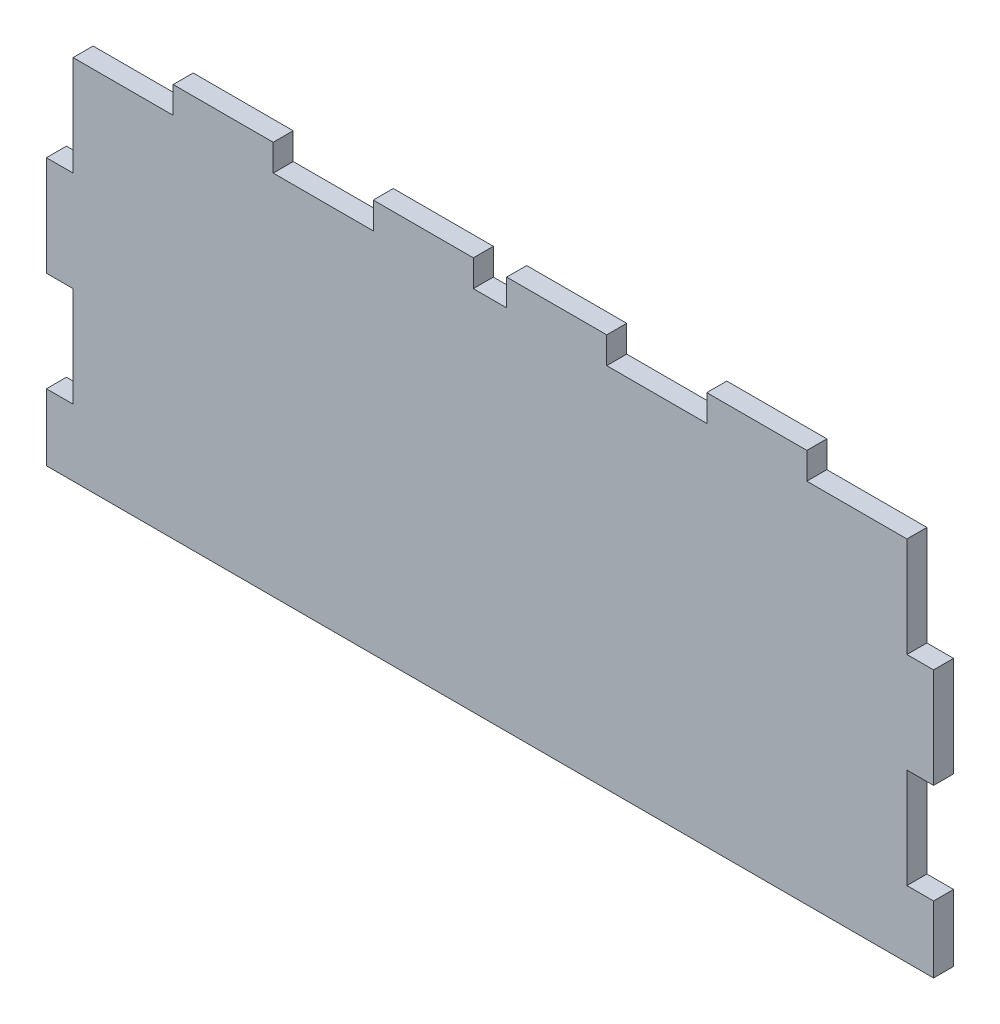
ISO-10303-21;
HEADER;
FILE_DESCRIPTION(('STEP AP214'),'2;1');
FILE_NAME('part.step','',(''),(''),'','','');
FILE_SCHEMA(('AUTOMOTIVE_DESIGN { 1 0 10303 214 1 1 1 1 }'));
ENDSEC;
DATA;
#1=APPLICATION_CONTEXT('core data for automotive mechanical design processes');
#2=APPLICATION_PROTOCOL_DEFINITION('international standard','automotive_design',2000,#1);
#3=PRODUCT_CONTEXT('',#1,'mechanical');
#4=PRODUCT('Part','Part','',(#3));
#5=PRODUCT_RELATED_PRODUCT_CATEGORY('part','',(#4));
#6=PRODUCT_DEFINITION_FORMATION('','',#4);
#7=PRODUCT_DEFINITION_CONTEXT('part definition',#1,'design');
#8=PRODUCT_DEFINITION('design','',#6,#7);
#9=PRODUCT_DEFINITION_SHAPE('','',#8);
#10=(LENGTH_UNIT() NAMED_UNIT(*) SI_UNIT(.MILLI.,.METRE.));
#11=(NAMED_UNIT(*) PLANE_ANGLE_UNIT() SI_UNIT($,.RADIAN.));
#12=(NAMED_UNIT(*) SI_UNIT($,.STERADIAN.) SOLID_ANGLE_UNIT());
#13=UNCERTAINTY_MEASURE_WITH_UNIT(LENGTH_MEASURE(1.E-05),#10,'distance_accuracy_value','');
#14=(GEOMETRIC_REPRESENTATION_CONTEXT(3) GLOBAL_UNCERTAINTY_ASSIGNED_CONTEXT((#13)) GLOBAL_UNIT_ASSIGNED_CONTEXT((#10,
#11,#12)) REPRESENTATION_CONTEXT('',''));
#15=CARTESIAN_POINT('',(0.,0.,0.));
#16=DIRECTION('',(0.,0.,1.));
#17=DIRECTION('',(1.,0.,0.));
#18=AXIS2_PLACEMENT_3D('',#15,#16,#17);
#19=CARTESIAN_POINT('',(0.,0.,3.));
#20=DIRECTION('',(-1.,0.,0.));
#21=DIRECTION('',(0.,0.,1.));
#22=AXIS2_PLACEMENT_3D('',#19,#20,#21);
#23=PLANE('',#22);
#24=DIRECTION('',(0.,0.,1.));
#25=VECTOR('',#24,1.);
#26=CARTESIAN_POINT('',(0.,10.,0.));
#27=LINE('',#26,#25);
#28=CARTESIAN_POINT('',(0.,10.,0.));
#29=VERTEX_POINT('',#28);
#30=CARTESIAN_POINT('',(0.,10.,3.));
#31=VERTEX_POINT('',#30);
#32=EDGE_CURVE('E61',#29,#31,#27,.T.);
#33=ORIENTED_EDGE('',*,*,#32,.F.);
#34=DIRECTION('',(0.,1.,0.));
#35=VECTOR('',#34,1.);
#36=CARTESIAN_POINT('',(0.,0.,0.));
#37=LINE('',#36,#35);
#38=CARTESIAN_POINT('',(0.,25.,0.));
#39=VERTEX_POINT('',#38);
#40=EDGE_CURVE('E464',#29,#39,#37,.T.);
#41=ORIENTED_EDGE('',*,*,#40,.T.);
#42=DIRECTION('',(0.,0.,1.));
#43=VECTOR('',#42,1.);
#44=CARTESIAN_POINT('',(0.,25.,0.));
#45=LINE('',#44,#43);
#46=CARTESIAN_POINT('',(0.,25.,3.));
#47=VERTEX_POINT('',#46);
#48=EDGE_CURVE('E400',#39,#47,#45,.T.);
#49=ORIENTED_EDGE('',*,*,#48,.T.);
#50=DIRECTION('',(0.,1.,0.));
#51=VECTOR('',#50,1.);
#52=CARTESIAN_POINT('',(0.,0.,3.));
#53=LINE('',#52,#51);
#54=EDGE_CURVE('E450',#31,#47,#53,.T.);
#55=ORIENTED_EDGE('',*,*,#54,.F.);
#56=EDGE_LOOP('',(#33,#41,#49,#55));
#57=FACE_BOUND('',#56,.T.);
#58=ADVANCED_FACE('F39',(#57),#23,.F.);
#59=DIRECTION('',(0.,0.,1.));
#60=VECTOR('',#59,1.);
#61=CARTESIAN_POINT('',(0.,40.,0.));
#62=LINE('',#61,#60);
#63=CARTESIAN_POINT('',(0.,40.,0.));
#64=VERTEX_POINT('',#63);
#65=CARTESIAN_POINT('',(0.,40.,3.));
#66=VERTEX_POINT('',#65);
#67=EDGE_CURVE('E268',#64,#66,#62,.T.);
#68=ORIENTED_EDGE('',*,*,#67,.F.);
#69=CARTESIAN_POINT('',(0.,55.,0.));
#70=VERTEX_POINT('',#69);
#71=EDGE_CURVE('E442',#64,#70,#37,.T.);
#72=ORIENTED_EDGE('',*,*,#71,.T.);
#73=DIRECTION('',(0.,0.,-1.));
#74=VECTOR('',#73,1.);
#75=CARTESIAN_POINT('',(0.,55.,3.));
#76=LINE('',#75,#74);
#77=CARTESIAN_POINT('',(0.,55.,3.));
#78=VERTEX_POINT('',#77);
#79=EDGE_CURVE('E11',#78,#70,#76,.T.);
#80=ORIENTED_EDGE('',*,*,#79,.F.);
#81=EDGE_CURVE('E448',#66,#78,#53,.T.);
#82=ORIENTED_EDGE('',*,*,#81,.F.);
#83=EDGE_LOOP('',(#68,#72,#80,#82));
#84=FACE_BOUND('',#83,.T.);
#85=ADVANCED_FACE('F551',(#84),#23,.F.);
#86=CARTESIAN_POINT('',(0.,55.,3.));
#87=DIRECTION('',(0.,-1.,0.));
#88=DIRECTION('',(1.,0.,0.));
#89=AXIS2_PLACEMENT_3D('',#86,#87,#88);
#90=PLANE('',#89);
#91=DIRECTION('',(0.,0.,1.));
#92=VECTOR('',#91,1.);
#93=CARTESIAN_POINT('',(-110.,55.,0.));
#94=LINE('',#93,#92);
#95=CARTESIAN_POINT('',(-110.,55.,0.));
#96=VERTEX_POINT('',#95);
#97=CARTESIAN_POINT('',(-110.,55.,3.));
#98=VERTEX_POINT('',#97);
#99=EDGE_CURVE('E360',#96,#98,#94,.T.);
#100=ORIENTED_EDGE('',*,*,#99,.F.);
#101=DIRECTION('',(-1.,0.,0.));
#102=VECTOR('',#101,1.);
#103=CARTESIAN_POINT('',(0.,55.,0.));
#104=LINE('',#103,#102);
#105=CARTESIAN_POINT('',(-125.,55.,0.));
#106=VERTEX_POINT('',#105);
#107=EDGE_CURVE('E470',#96,#106,#104,.T.);
#108=ORIENTED_EDGE('',*,*,#107,.T.);
#109=DIRECTION('',(0.,0.,-1.));
#110=VECTOR('',#109,1.);
#111=CARTESIAN_POINT('',(-125.,55.,3.));
#112=LINE('',#111,#110);
#113=CARTESIAN_POINT('',(-125.,55.,3.));
#114=VERTEX_POINT('',#113);
#115=EDGE_CURVE('E46',#114,#106,#112,.T.);
#116=ORIENTED_EDGE('',*,*,#115,.F.);
#117=DIRECTION('',(-1.,0.,0.));
#118=VECTOR('',#117,1.);
#119=CARTESIAN_POINT('',(0.,55.,3.));
#120=LINE('',#119,#118);
#121=EDGE_CURVE('E457',#98,#114,#120,.T.);
#122=ORIENTED_EDGE('',*,*,#121,.F.);
#123=EDGE_LOOP('',(#100,#108,#116,#122));
#124=FACE_BOUND('',#123,.T.);
#125=ADVANCED_FACE('F549',(#124),#90,.F.);
#126=CARTESIAN_POINT('',(-80.0000000000001,55.,0.));
#127=VERTEX_POINT('',#126);
#128=CARTESIAN_POINT('',(-95.0000000000001,55.,0.));
#129=VERTEX_POINT('',#128);
#130=EDGE_CURVE('E504',#127,#129,#104,.T.);
#131=ORIENTED_EDGE('',*,*,#130,.T.);
#132=DIRECTION('',(0.,0.,1.));
#133=VECTOR('',#132,1.);
#134=CARTESIAN_POINT('',(-95.0000000000001,55.,0.));
#135=LINE('',#134,#133);
#136=CARTESIAN_POINT('',(-95.0000000000001,55.,3.));
#137=VERTEX_POINT('',#136);
#138=EDGE_CURVE('E362',#129,#137,#135,.T.);
#139=ORIENTED_EDGE('',*,*,#138,.T.);
#140=CARTESIAN_POINT('',(-80.0000000000001,55.,3.));
#141=VERTEX_POINT('',#140);
#142=EDGE_CURVE('E494',#141,#137,#120,.T.);
#143=ORIENTED_EDGE('',*,*,#142,.F.);
#144=DIRECTION('',(0.,0.,1.));
#145=VECTOR('',#144,1.);
#146=CARTESIAN_POINT('',(-80.0000000000001,55.,0.));
#147=LINE('',#146,#145);
#148=EDGE_CURVE('E264',#127,#141,#147,.T.);
#149=ORIENTED_EDGE('',*,*,#148,.F.);
#150=EDGE_LOOP('',(#131,#139,#143,#149));
#151=FACE_BOUND('',#150,.T.);
#152=ADVANCED_FACE('F540',(#151),#90,.F.);
#153=CARTESIAN_POINT('',(-60.,55.,0.));
#154=VERTEX_POINT('',#153);
#155=CARTESIAN_POINT('',(-65.0000000000001,55.,0.));
#156=VERTEX_POINT('',#155);
#157=EDGE_CURVE('E506',#154,#156,#104,.T.);
#158=ORIENTED_EDGE('',*,*,#157,.T.);
#159=DIRECTION('',(0.,0.,1.));
#160=VECTOR('',#159,1.);
#161=CARTESIAN_POINT('',(-65.0000000000001,55.,0.));
#162=LINE('',#161,#160);
#163=CARTESIAN_POINT('',(-65.0000000000001,55.,3.));
#164=VERTEX_POINT('',#163);
#165=EDGE_CURVE('E533',#156,#164,#162,.T.);
#166=ORIENTED_EDGE('',*,*,#165,.T.);
#167=CARTESIAN_POINT('',(-60.,55.,3.));
#168=VERTEX_POINT('',#167);
#169=EDGE_CURVE('E495',#168,#164,#120,.T.);
#170=ORIENTED_EDGE('',*,*,#169,.F.);
#171=DIRECTION('',(0.,0.,1.));
#172=VECTOR('',#171,1.);
#173=CARTESIAN_POINT('',(-60.,55.,0.));
#174=LINE('',#173,#172);
#175=EDGE_CURVE('E287',#154,#168,#174,.T.);
#176=ORIENTED_EDGE('',*,*,#175,.F.);
#177=EDGE_LOOP('',(#158,#166,#170,#176));
#178=FACE_BOUND('',#177,.T.);
#179=ADVANCED_FACE('F532',(#178),#90,.F.);
#180=CARTESIAN_POINT('',(-30.,55.,0.));
#181=VERTEX_POINT('',#180);
#182=CARTESIAN_POINT('',(-45.,55.,0.));
#183=VERTEX_POINT('',#182);
#184=EDGE_CURVE('E469',#181,#183,#104,.T.);
#185=ORIENTED_EDGE('',*,*,#184,.T.);
#186=DIRECTION('',(0.,0.,1.));
#187=VECTOR('',#186,1.);
#188=CARTESIAN_POINT('',(-45.,55.,0.));
#189=LINE('',#188,#187);
#190=CARTESIAN_POINT('',(-45.,55.,3.));
#191=VERTEX_POINT('',#190);
#192=EDGE_CURVE('E289',#183,#191,#189,.T.);
#193=ORIENTED_EDGE('',*,*,#192,.T.);
#194=CARTESIAN_POINT('',(-30.,55.,3.));
#195=VERTEX_POINT('',#194);
#196=EDGE_CURVE('E456',#195,#191,#120,.T.);
#197=ORIENTED_EDGE('',*,*,#196,.F.);
#198=DIRECTION('',(0.,0.,1.));
#199=VECTOR('',#198,1.);
#200=CARTESIAN_POINT('',(-30.,55.,0.));
#201=LINE('',#200,#199);
#202=EDGE_CURVE('E310',#181,#195,#201,.T.);
#203=ORIENTED_EDGE('',*,*,#202,.F.);
#204=EDGE_LOOP('',(#185,#193,#197,#203));
#205=FACE_BOUND('',#204,.T.);
#206=ADVANCED_FACE('F518',(#205),#90,.F.);
#207=CARTESIAN_POINT('',(-125.,0.,3.));
#208=DIRECTION('',(1.,0.,0.));
#209=DIRECTION('',(0.,0.,-1.));
#210=AXIS2_PLACEMENT_3D('',#207,#208,#209);
#211=PLANE('',#210);
#212=DIRECTION('',(0.,-1.,0.));
#213=VECTOR('',#212,1.);
#214=CARTESIAN_POINT('',(-125.,0.,0.));
#215=LINE('',#214,#213);
#216=CARTESIAN_POINT('',(-125.,25.,0.));
#217=VERTEX_POINT('',#216);
#218=CARTESIAN_POINT('',(-125.,10.,0.));
#219=VERTEX_POINT('',#218);
#220=EDGE_CURVE('E468',#217,#219,#215,.T.);
#221=ORIENTED_EDGE('',*,*,#220,.T.);
#222=DIRECTION('',(0.,0.,1.));
#223=VECTOR('',#222,1.);
#224=CARTESIAN_POINT('',(-125.,10.,0.));
#225=LINE('',#224,#223);
#226=CARTESIAN_POINT('',(-125.,10.,3.));
#227=VERTEX_POINT('',#226);
#228=EDGE_CURVE('E335',#219,#227,#225,.T.);
#229=ORIENTED_EDGE('',*,*,#228,.T.);
#230=DIRECTION('',(0.,-1.,0.));
#231=VECTOR('',#230,1.);
#232=CARTESIAN_POINT('',(-125.,0.,3.));
#233=LINE('',#232,#231);
#234=CARTESIAN_POINT('',(-125.,25.,3.));
#235=VERTEX_POINT('',#234);
#236=EDGE_CURVE('E455',#235,#227,#233,.T.);
#237=ORIENTED_EDGE('',*,*,#236,.F.);
#238=DIRECTION('',(0.,0.,1.));
#239=VECTOR('',#238,1.);
#240=CARTESIAN_POINT('',(-125.,25.,0.));
#241=LINE('',#240,#239);
#242=EDGE_CURVE('E443',#217,#235,#241,.T.);
#243=ORIENTED_EDGE('',*,*,#242,.F.);
#244=EDGE_LOOP('',(#221,#229,#237,#243));
#245=FACE_BOUND('',#244,.T.);
#246=ADVANCED_FACE('F560',(#245),#211,.F.);
#247=CARTESIAN_POINT('',(-15.,55.,0.));
#248=VERTEX_POINT('',#247);
#249=EDGE_CURVE('E465',#70,#248,#104,.T.);
#250=ORIENTED_EDGE('',*,*,#249,.T.);
#251=DIRECTION('',(0.,0.,1.));
#252=VECTOR('',#251,1.);
#253=CARTESIAN_POINT('',(-15.,55.,0.));
#254=LINE('',#253,#252);
#255=CARTESIAN_POINT('',(-15.,55.,3.));
#256=VERTEX_POINT('',#255);
#257=EDGE_CURVE('E313',#248,#256,#254,.T.);
#258=ORIENTED_EDGE('',*,*,#257,.T.);
#259=EDGE_CURVE('E452',#78,#256,#120,.T.);
#260=ORIENTED_EDGE('',*,*,#259,.F.);
#261=ORIENTED_EDGE('',*,*,#79,.T.);
#262=EDGE_LOOP('',(#250,#258,#260,#261));
#263=FACE_BOUND('',#262,.T.);
#264=ADVANCED_FACE('F552',(#263),#90,.F.);
#265=CARTESIAN_POINT('',(-125.,40.,0.));
#266=VERTEX_POINT('',#265);
#267=EDGE_CURVE('E471',#106,#266,#215,.T.);
#268=ORIENTED_EDGE('',*,*,#267,.T.);
#269=DIRECTION('',(0.,0.,1.));
#270=VECTOR('',#269,1.);
#271=CARTESIAN_POINT('',(-125.,40.,0.));
#272=LINE('',#271,#270);
#273=CARTESIAN_POINT('',(-125.,40.,3.));
#274=VERTEX_POINT('',#273);
#275=EDGE_CURVE('E439',#266,#274,#272,.T.);
#276=ORIENTED_EDGE('',*,*,#275,.T.);
#277=EDGE_CURVE('E458',#114,#274,#233,.T.);
#278=ORIENTED_EDGE('',*,*,#277,.F.);
#279=ORIENTED_EDGE('',*,*,#115,.T.);
#280=EDGE_LOOP('',(#268,#276,#278,#279));
#281=FACE_BOUND('',#280,.T.);
#282=ADVANCED_FACE('F479',(#281),#211,.F.);
#283=CARTESIAN_POINT('',(0.,0.,3.));
#284=DIRECTION('',(0.,1.,0.));
#285=DIRECTION('',(-1.,0.,0.));
#286=AXIS2_PLACEMENT_3D('',#283,#284,#285);
#287=PLANE('',#286);
#288=DIRECTION('',(1.,0.,0.));
#289=VECTOR('',#288,1.);
#290=CARTESIAN_POINT('',(0.,0.,0.));
#291=LINE('',#290,#289);
#292=CARTESIAN_POINT('',(-129.,0.,0.));
#293=VERTEX_POINT('',#292);
#294=CARTESIAN_POINT('',(4.,0.,0.));
#295=VERTEX_POINT('',#294);
#296=EDGE_CURVE('E451',#293,#295,#291,.T.);
#297=ORIENTED_EDGE('',*,*,#296,.T.);
#298=DIRECTION('',(0.,0.,1.));
#299=VECTOR('',#298,1.);
#300=CARTESIAN_POINT('',(4.,0.,0.));
#301=LINE('',#300,#299);
#302=CARTESIAN_POINT('',(4.,0.,3.));
#303=VERTEX_POINT('',#302);
#304=EDGE_CURVE('E383',#295,#303,#301,.T.);
#305=ORIENTED_EDGE('',*,*,#304,.T.);
#306=DIRECTION('',(1.,0.,0.));
#307=VECTOR('',#306,1.);
#308=CARTESIAN_POINT('',(0.,0.,3.));
#309=LINE('',#308,#307);
#310=CARTESIAN_POINT('',(-129.,0.,3.));
#311=VERTEX_POINT('',#310);
#312=EDGE_CURVE('E461',#311,#303,#309,.T.);
#313=ORIENTED_EDGE('',*,*,#312,.F.);
#314=DIRECTION('',(0.,0.,1.));
#315=VECTOR('',#314,1.);
#316=CARTESIAN_POINT('',(-129.,0.,0.));
#317=LINE('',#316,#315);
#318=EDGE_CURVE('E341',#293,#311,#317,.T.);
#319=ORIENTED_EDGE('',*,*,#318,.F.);
#320=EDGE_LOOP('',(#297,#305,#313,#319));
#321=FACE_BOUND('',#320,.T.);
#322=ADVANCED_FACE('F581',(#321),#287,.F.);
#323=CARTESIAN_POINT('',(0.,0.,3.));
#324=DIRECTION('',(0.,0.,1.));
#325=DIRECTION('',(1.,0.,0.));
#326=AXIS2_PLACEMENT_3D('',#323,#324,#325);
#327=PLANE('',#326);
#328=ORIENTED_EDGE('',*,*,#312,.T.);
#329=DIRECTION('',(0.,1.,0.));
#330=VECTOR('',#329,1.);
#331=CARTESIAN_POINT('',(4.,10.,3.));
#332=LINE('',#331,#330);
#333=CARTESIAN_POINT('',(4.,10.,3.));
#334=VERTEX_POINT('',#333);
#335=EDGE_CURVE('E367',#303,#334,#332,.T.);
#336=ORIENTED_EDGE('',*,*,#335,.T.);
#337=DIRECTION('',(-1.,0.,0.));
#338=VECTOR('',#337,1.);
#339=CARTESIAN_POINT('',(0.,10.,3.));
#340=LINE('',#339,#338);
#341=EDGE_CURVE('E390',#334,#31,#340,.T.);
#342=ORIENTED_EDGE('',*,*,#341,.T.);
#343=ORIENTED_EDGE('',*,*,#54,.T.);
#344=DIRECTION('',(1.,0.,0.));
#345=VECTOR('',#344,1.);
#346=CARTESIAN_POINT('',(0.,25.,3.));
#347=LINE('',#346,#345);
#348=CARTESIAN_POINT('',(4.,25.,3.));
#349=VERTEX_POINT('',#348);
#350=EDGE_CURVE('E53',#47,#349,#347,.T.);
#351=ORIENTED_EDGE('',*,*,#350,.T.);
#352=DIRECTION('',(0.,1.,0.));
#353=VECTOR('',#352,1.);
#354=CARTESIAN_POINT('',(4.,40.,3.));
#355=LINE('',#354,#353);
#356=CARTESIAN_POINT('',(4.,40.,3.));
#357=VERTEX_POINT('',#356);
#358=EDGE_CURVE('E411',#349,#357,#355,.T.);
#359=ORIENTED_EDGE('',*,*,#358,.T.);
#360=DIRECTION('',(-1.,0.,0.));
#361=VECTOR('',#360,1.);
#362=CARTESIAN_POINT('',(4.,40.,3.));
#363=LINE('',#362,#361);
#364=EDGE_CURVE('E408',#357,#66,#363,.T.);
#365=ORIENTED_EDGE('',*,*,#364,.T.);
#366=ORIENTED_EDGE('',*,*,#81,.T.);
#367=ORIENTED_EDGE('',*,*,#259,.T.);
#368=DIRECTION('',(0.,1.,0.));
#369=VECTOR('',#368,1.);
#370=CARTESIAN_POINT('',(-15.,59.,3.));
#371=LINE('',#370,#369);
#372=CARTESIAN_POINT('',(-15.,59.,3.));
#373=VERTEX_POINT('',#372);
#374=EDGE_CURVE('E323',#256,#373,#371,.T.);
#375=ORIENTED_EDGE('',*,*,#374,.T.);
#376=DIRECTION('',(-1.,0.,0.));
#377=VECTOR('',#376,1.);
#378=CARTESIAN_POINT('',(-15.,59.,3.));
#379=LINE('',#378,#377);
#380=CARTESIAN_POINT('',(-30.,59.,3.));
#381=VERTEX_POINT('',#380);
#382=EDGE_CURVE('E320',#373,#381,#379,.T.);
#383=ORIENTED_EDGE('',*,*,#382,.T.);
#384=DIRECTION('',(0.,-1.,0.));
#385=VECTOR('',#384,1.);
#386=CARTESIAN_POINT('',(-30.,59.,3.));
#387=LINE('',#386,#385);
#388=EDGE_CURVE('E294',#381,#195,#387,.T.);
#389=ORIENTED_EDGE('',*,*,#388,.T.);
#390=ORIENTED_EDGE('',*,*,#196,.T.);
#391=DIRECTION('',(0.,1.,0.));
#392=VECTOR('',#391,1.);
#393=CARTESIAN_POINT('',(-45.,59.,3.));
#394=LINE('',#393,#392);
#395=CARTESIAN_POINT('',(-45.,59.,3.));
#396=VERTEX_POINT('',#395);
#397=EDGE_CURVE('E295',#191,#396,#394,.T.);
#398=ORIENTED_EDGE('',*,*,#397,.T.);
#399=DIRECTION('',(-1.,0.,0.));
#400=VECTOR('',#399,1.);
#401=CARTESIAN_POINT('',(-45.,59.,3.));
#402=LINE('',#401,#400);
#403=CARTESIAN_POINT('',(-60.,59.,3.));
#404=VERTEX_POINT('',#403);
#405=EDGE_CURVE('E258',#396,#404,#402,.T.);
#406=ORIENTED_EDGE('',*,*,#405,.T.);
#407=DIRECTION('',(0.,-1.,0.));
#408=VECTOR('',#407,1.);
#409=CARTESIAN_POINT('',(-60.,59.,3.));
#410=LINE('',#409,#408);
#411=EDGE_CURVE('E298',#404,#168,#410,.T.);
#412=ORIENTED_EDGE('',*,*,#411,.T.);
#413=ORIENTED_EDGE('',*,*,#169,.T.);
#414=DIRECTION('',(0.,1.,0.));
#415=VECTOR('',#414,1.);
#416=CARTESIAN_POINT('',(-65.0000000000001,59.,3.));
#417=LINE('',#416,#415);
#418=CARTESIAN_POINT('',(-65.0000000000001,59.,3.));
#419=VERTEX_POINT('',#418);
#420=EDGE_CURVE('E269',#164,#419,#417,.T.);
#421=ORIENTED_EDGE('',*,*,#420,.T.);
#422=DIRECTION('',(-1.,0.,0.));
#423=VECTOR('',#422,1.);
#424=CARTESIAN_POINT('',(-65.0000000000001,59.,3.));
#425=LINE('',#424,#423);
#426=CARTESIAN_POINT('',(-80.0000000000001,59.,3.));
#427=VERTEX_POINT('',#426);
#428=EDGE_CURVE('E252',#419,#427,#425,.T.);
#429=ORIENTED_EDGE('',*,*,#428,.T.);
#430=DIRECTION('',(0.,-1.,0.));
#431=VECTOR('',#430,1.);
#432=CARTESIAN_POINT('',(-80.0000000000001,59.,3.));
#433=LINE('',#432,#431);
#434=EDGE_CURVE('E261',#427,#141,#433,.T.);
#435=ORIENTED_EDGE('',*,*,#434,.T.);
#436=ORIENTED_EDGE('',*,*,#142,.T.);
#437=DIRECTION('',(0.,1.,0.));
#438=VECTOR('',#437,1.);
#439=CARTESIAN_POINT('',(-95.0000000000001,59.,3.));
#440=LINE('',#439,#438);
#441=CARTESIAN_POINT('',(-95.0000000000001,59.,3.));
#442=VERTEX_POINT('',#441);
#443=EDGE_CURVE('E368',#137,#442,#440,.T.);
#444=ORIENTED_EDGE('',*,*,#443,.T.);
#445=DIRECTION('',(-1.,0.,0.));
#446=VECTOR('',#445,1.);
#447=CARTESIAN_POINT('',(-95.0000000000001,59.,3.));
#448=LINE('',#447,#446);
#449=CARTESIAN_POINT('',(-110.,59.,3.));
#450=VERTEX_POINT('',#449);
#451=EDGE_CURVE('E344',#442,#450,#448,.T.);
#452=ORIENTED_EDGE('',*,*,#451,.T.);
#453=DIRECTION('',(0.,-1.,0.));
#454=VECTOR('',#453,1.);
#455=CARTESIAN_POINT('',(-110.,59.,3.));
#456=LINE('',#455,#454);
#457=EDGE_CURVE('E371',#450,#98,#456,.T.);
#458=ORIENTED_EDGE('',*,*,#457,.T.);
#459=ORIENTED_EDGE('',*,*,#121,.T.);
#460=ORIENTED_EDGE('',*,*,#277,.T.);
#461=DIRECTION('',(-1.,0.,0.));
#462=VECTOR('',#461,1.);
#463=CARTESIAN_POINT('',(-129.,40.,3.));
#464=LINE('',#463,#462);
#465=CARTESIAN_POINT('',(-129.,40.,3.));
#466=VERTEX_POINT('',#465);
#467=EDGE_CURVE('E352',#274,#466,#464,.T.);
#468=ORIENTED_EDGE('',*,*,#467,.T.);
#469=DIRECTION('',(0.,-1.,0.));
#470=VECTOR('',#469,1.);
#471=CARTESIAN_POINT('',(-129.,40.,3.));
#472=LINE('',#471,#470);
#473=CARTESIAN_POINT('',(-129.,25.,3.));
#474=VERTEX_POINT('',#473);
#475=EDGE_CURVE('E434',#466,#474,#472,.T.);
#476=ORIENTED_EDGE('',*,*,#475,.T.);
#477=DIRECTION('',(1.,0.,0.));
#478=VECTOR('',#477,1.);
#479=CARTESIAN_POINT('',(-125.,25.,3.));
#480=LINE('',#479,#478);
#481=EDGE_CURVE('E426',#474,#235,#480,.T.);
#482=ORIENTED_EDGE('',*,*,#481,.T.);
#483=ORIENTED_EDGE('',*,*,#236,.T.);
#484=DIRECTION('',(-1.,0.,0.));
#485=VECTOR('',#484,1.);
#486=CARTESIAN_POINT('',(-125.,10.,3.));
#487=LINE('',#486,#485);
#488=CARTESIAN_POINT('',(-129.,10.,3.));
#489=VERTEX_POINT('',#488);
#490=EDGE_CURVE('E348',#227,#489,#487,.T.);
#491=ORIENTED_EDGE('',*,*,#490,.T.);
#492=DIRECTION('',(0.,-1.,0.));
#493=VECTOR('',#492,1.);
#494=CARTESIAN_POINT('',(-129.,10.,3.));
#495=LINE('',#494,#493);
#496=EDGE_CURVE('E345',#489,#311,#495,.T.);
#497=ORIENTED_EDGE('',*,*,#496,.T.);
#498=EDGE_LOOP('',(#328,#336,#342,#343,#351,#359,#365,#366,#367,#375,#383,#389,#390,#398,#406,
#412,#413,#421,#429,#435,#436,#444,#452,#458,#459,#460,#468,#476,#482,#483,#491,#497));
#499=FACE_BOUND('',#498,.T.);
#500=ADVANCED_FACE('F272',(#499),#327,.T.);
#501=CARTESIAN_POINT('',(0.,0.,0.));
#502=DIRECTION('',(0.,0.,1.));
#503=DIRECTION('',(1.,0.,0.));
#504=AXIS2_PLACEMENT_3D('',#501,#502,#503);
#505=PLANE('',#504);
#506=ORIENTED_EDGE('',*,*,#40,.F.);
#507=DIRECTION('',(-1.,0.,0.));
#508=VECTOR('',#507,1.);
#509=CARTESIAN_POINT('',(0.,10.,0.));
#510=LINE('',#509,#508);
#511=CARTESIAN_POINT('',(4.,10.,0.));
#512=VERTEX_POINT('',#511);
#513=EDGE_CURVE('E386',#512,#29,#510,.T.);
#514=ORIENTED_EDGE('',*,*,#513,.F.);
#515=DIRECTION('',(0.,1.,0.));
#516=VECTOR('',#515,1.);
#517=CARTESIAN_POINT('',(4.,10.,0.));
#518=LINE('',#517,#516);
#519=EDGE_CURVE('E393',#295,#512,#518,.T.);
#520=ORIENTED_EDGE('',*,*,#519,.F.);
#521=ORIENTED_EDGE('',*,*,#296,.F.);
#522=DIRECTION('',(0.,-1.,0.));
#523=VECTOR('',#522,1.);
#524=CARTESIAN_POINT('',(-129.,10.,0.));
#525=LINE('',#524,#523);
#526=CARTESIAN_POINT('',(-129.,10.,0.));
#527=VERTEX_POINT('',#526);
#528=EDGE_CURVE('E338',#527,#293,#525,.T.);
#529=ORIENTED_EDGE('',*,*,#528,.F.);
#530=DIRECTION('',(-1.,0.,0.));
#531=VECTOR('',#530,1.);
#532=CARTESIAN_POINT('',(-125.,10.,0.));
#533=LINE('',#532,#531);
#534=EDGE_CURVE('E349',#219,#527,#533,.T.);
#535=ORIENTED_EDGE('',*,*,#534,.F.);
#536=ORIENTED_EDGE('',*,*,#220,.F.);
#537=DIRECTION('',(1.,0.,0.));
#538=VECTOR('',#537,1.);
#539=CARTESIAN_POINT('',(-125.,25.,0.));
#540=LINE('',#539,#538);
#541=CARTESIAN_POINT('',(-129.,25.,0.));
#542=VERTEX_POINT('',#541);
#543=EDGE_CURVE('E429',#542,#217,#540,.T.);
#544=ORIENTED_EDGE('',*,*,#543,.F.);
#545=DIRECTION('',(0.,-1.,0.));
#546=VECTOR('',#545,1.);
#547=CARTESIAN_POINT('',(-129.,40.,0.));
#548=LINE('',#547,#546);
#549=CARTESIAN_POINT('',(-129.,40.,0.));
#550=VERTEX_POINT('',#549);
#551=EDGE_CURVE('E425',#550,#542,#548,.T.);
#552=ORIENTED_EDGE('',*,*,#551,.F.);
#553=DIRECTION('',(-1.,0.,0.));
#554=VECTOR('',#553,1.);
#555=CARTESIAN_POINT('',(-129.,40.,0.));
#556=LINE('',#555,#554);
#557=EDGE_CURVE('E422',#266,#550,#556,.T.);
#558=ORIENTED_EDGE('',*,*,#557,.F.);
#559=ORIENTED_EDGE('',*,*,#267,.F.);
#560=ORIENTED_EDGE('',*,*,#107,.F.);
#561=DIRECTION('',(0.,-1.,0.));
#562=VECTOR('',#561,1.);
#563=CARTESIAN_POINT('',(-110.,59.,0.));
#564=LINE('',#563,#562);
#565=CARTESIAN_POINT('',(-110.,59.,0.));
#566=VERTEX_POINT('',#565);
#567=EDGE_CURVE('E379',#566,#96,#564,.T.);
#568=ORIENTED_EDGE('',*,*,#567,.F.);
#569=DIRECTION('',(-1.,0.,0.));
#570=VECTOR('',#569,1.);
#571=CARTESIAN_POINT('',(-95.0000000000001,59.,0.));
#572=LINE('',#571,#570);
#573=CARTESIAN_POINT('',(-95.0000000000001,59.,0.));
#574=VERTEX_POINT('',#573);
#575=EDGE_CURVE('E372',#574,#566,#572,.T.);
#576=ORIENTED_EDGE('',*,*,#575,.F.);
#577=DIRECTION('',(0.,1.,0.));
#578=VECTOR('',#577,1.);
#579=CARTESIAN_POINT('',(-95.0000000000001,59.,0.));
#580=LINE('',#579,#578);
#581=EDGE_CURVE('E359',#129,#574,#580,.T.);
#582=ORIENTED_EDGE('',*,*,#581,.F.);
#583=ORIENTED_EDGE('',*,*,#130,.F.);
#584=DIRECTION('',(0.,-1.,0.));
#585=VECTOR('',#584,1.);
#586=CARTESIAN_POINT('',(-80.0000000000001,59.,0.));
#587=LINE('',#586,#585);
#588=CARTESIAN_POINT('',(-80.0000000000001,59.,0.));
#589=VERTEX_POINT('',#588);
#590=EDGE_CURVE('E274',#589,#127,#587,.T.);
#591=ORIENTED_EDGE('',*,*,#590,.F.);
#592=DIRECTION('',(-1.,0.,0.));
#593=VECTOR('',#592,1.);
#594=CARTESIAN_POINT('',(-65.0000000000001,59.,0.));
#595=LINE('',#594,#593);
#596=CARTESIAN_POINT('',(-65.0000000000001,59.,0.));
#597=VERTEX_POINT('',#596);
#598=EDGE_CURVE('E254',#597,#589,#595,.T.);
#599=ORIENTED_EDGE('',*,*,#598,.F.);
#600=DIRECTION('',(0.,1.,0.));
#601=VECTOR('',#600,1.);
#602=CARTESIAN_POINT('',(-65.0000000000001,59.,0.));
#603=LINE('',#602,#601);
#604=EDGE_CURVE('E277',#156,#597,#603,.T.);
#605=ORIENTED_EDGE('',*,*,#604,.F.);
#606=ORIENTED_EDGE('',*,*,#157,.F.);
#607=DIRECTION('',(0.,-1.,0.));
#608=VECTOR('',#607,1.);
#609=CARTESIAN_POINT('',(-60.,59.,0.));
#610=LINE('',#609,#608);
#611=CARTESIAN_POINT('',(-60.,59.,0.));
#612=VERTEX_POINT('',#611);
#613=EDGE_CURVE('E306',#612,#154,#610,.T.);
#614=ORIENTED_EDGE('',*,*,#613,.F.);
#615=DIRECTION('',(-1.,0.,0.));
#616=VECTOR('',#615,1.);
#617=CARTESIAN_POINT('',(-45.,59.,0.));
#618=LINE('',#617,#616);
#619=CARTESIAN_POINT('',(-45.,59.,0.));
#620=VERTEX_POINT('',#619);
#621=EDGE_CURVE('E299',#620,#612,#618,.T.);
#622=ORIENTED_EDGE('',*,*,#621,.F.);
#623=DIRECTION('',(0.,1.,0.));
#624=VECTOR('',#623,1.);
#625=CARTESIAN_POINT('',(-45.,59.,0.));
#626=LINE('',#625,#624);
#627=EDGE_CURVE('E286',#183,#620,#626,.T.);
#628=ORIENTED_EDGE('',*,*,#627,.F.);
#629=ORIENTED_EDGE('',*,*,#184,.F.);
#630=DIRECTION('',(0.,-1.,0.));
#631=VECTOR('',#630,1.);
#632=CARTESIAN_POINT('',(-30.,59.,0.));
#633=LINE('',#632,#631);
#634=CARTESIAN_POINT('',(-30.,59.,0.));
#635=VERTEX_POINT('',#634);
#636=EDGE_CURVE('E324',#635,#181,#633,.T.);
#637=ORIENTED_EDGE('',*,*,#636,.F.);
#638=DIRECTION('',(-1.,0.,0.));
#639=VECTOR('',#638,1.);
#640=CARTESIAN_POINT('',(-15.,59.,0.));
#641=LINE('',#640,#639);
#642=CARTESIAN_POINT('',(-15.,59.,0.));
#643=VERTEX_POINT('',#642);
#644=EDGE_CURVE('E312',#643,#635,#641,.T.);
#645=ORIENTED_EDGE('',*,*,#644,.F.);
#646=DIRECTION('',(0.,1.,0.));
#647=VECTOR('',#646,1.);
#648=CARTESIAN_POINT('',(-15.,59.,0.));
#649=LINE('',#648,#647);
#650=EDGE_CURVE('E331',#248,#643,#649,.T.);
#651=ORIENTED_EDGE('',*,*,#650,.F.);
#652=ORIENTED_EDGE('',*,*,#249,.F.);
#653=ORIENTED_EDGE('',*,*,#71,.F.);
#654=DIRECTION('',(-1.,0.,0.));
#655=VECTOR('',#654,1.);
#656=CARTESIAN_POINT('',(4.,40.,0.));
#657=LINE('',#656,#655);
#658=CARTESIAN_POINT('',(4.,40.,0.));
#659=VERTEX_POINT('',#658);
#660=EDGE_CURVE('E402',#659,#64,#657,.T.);
#661=ORIENTED_EDGE('',*,*,#660,.F.);
#662=DIRECTION('',(0.,1.,0.));
#663=VECTOR('',#662,1.);
#664=CARTESIAN_POINT('',(4.,40.,0.));
#665=LINE('',#664,#663);
#666=CARTESIAN_POINT('',(4.,25.,0.));
#667=VERTEX_POINT('',#666);
#668=EDGE_CURVE('E417',#667,#659,#665,.T.);
#669=ORIENTED_EDGE('',*,*,#668,.F.);
#670=DIRECTION('',(1.,0.,0.));
#671=VECTOR('',#670,1.);
#672=CARTESIAN_POINT('',(0.,25.,0.));
#673=LINE('',#672,#671);
#674=EDGE_CURVE('E412',#39,#667,#673,.T.);
#675=ORIENTED_EDGE('',*,*,#674,.F.);
#676=EDGE_LOOP('',(#506,#514,#520,#521,#529,#535,#536,#544,#552,#558,#559,#560,#568,#576,#582,
#583,#591,#599,#605,#606,#614,#622,#628,#629,#637,#645,#651,#652,#653,#661,#669,#675));
#677=FACE_BOUND('',#676,.T.);
#678=ADVANCED_FACE('F485',(#677),#505,.F.);
#679=CARTESIAN_POINT('',(-129.,40.,0.));
#680=DIRECTION('',(0.,1.,0.));
#681=DIRECTION('',(0.,0.,1.));
#682=AXIS2_PLACEMENT_3D('',#679,#680,#681);
#683=PLANE('',#682);
#684=ORIENTED_EDGE('',*,*,#467,.F.);
#685=ORIENTED_EDGE('',*,*,#275,.F.);
#686=ORIENTED_EDGE('',*,*,#557,.T.);
#687=DIRECTION('',(0.,0.,1.));
#688=VECTOR('',#687,1.);
#689=CARTESIAN_POINT('',(-129.,40.,0.));
#690=LINE('',#689,#688);
#691=EDGE_CURVE('E431',#550,#466,#690,.T.);
#692=ORIENTED_EDGE('',*,*,#691,.T.);
#693=EDGE_LOOP('',(#684,#685,#686,#692));
#694=FACE_BOUND('',#693,.T.);
#695=ADVANCED_FACE('F490',(#694),#683,.T.);
#696=CARTESIAN_POINT('',(-125.,25.,0.));
#697=DIRECTION('',(0.,-1.,0.));
#698=DIRECTION('',(0.,0.,-1.));
#699=AXIS2_PLACEMENT_3D('',#696,#697,#698);
#700=PLANE('',#699);
#701=ORIENTED_EDGE('',*,*,#481,.F.);
#702=DIRECTION('',(0.,0.,1.));
#703=VECTOR('',#702,1.);
#704=CARTESIAN_POINT('',(-129.,25.,0.));
#705=LINE('',#704,#703);
#706=EDGE_CURVE('E445',#542,#474,#705,.T.);
#707=ORIENTED_EDGE('',*,*,#706,.F.);
#708=ORIENTED_EDGE('',*,*,#543,.T.);
#709=ORIENTED_EDGE('',*,*,#242,.T.);
#710=EDGE_LOOP('',(#701,#707,#708,#709));
#711=FACE_BOUND('',#710,.T.);
#712=ADVANCED_FACE('F707',(#711),#700,.T.);
#713=CARTESIAN_POINT('',(-129.,40.,0.));
#714=DIRECTION('',(-1.,0.,0.));
#715=DIRECTION('',(0.,0.,1.));
#716=AXIS2_PLACEMENT_3D('',#713,#714,#715);
#717=PLANE('',#716);
#718=ORIENTED_EDGE('',*,*,#475,.F.);
#719=ORIENTED_EDGE('',*,*,#691,.F.);
#720=ORIENTED_EDGE('',*,*,#551,.T.);
#721=ORIENTED_EDGE('',*,*,#706,.T.);
#722=EDGE_LOOP('',(#718,#719,#720,#721));
#723=FACE_BOUND('',#722,.T.);
#724=ADVANCED_FACE('F716',(#723),#717,.T.);
#725=CARTESIAN_POINT('',(-129.,10.,0.));
#726=DIRECTION('',(-1.,0.,0.));
#727=DIRECTION('',(0.,0.,1.));
#728=AXIS2_PLACEMENT_3D('',#725,#726,#727);
#729=PLANE('',#728);
#730=ORIENTED_EDGE('',*,*,#496,.F.);
#731=DIRECTION('',(0.,0.,1.));
#732=VECTOR('',#731,1.);
#733=CARTESIAN_POINT('',(-129.,10.,0.));
#734=LINE('',#733,#732);
#735=EDGE_CURVE('E339',#527,#489,#734,.T.);
#736=ORIENTED_EDGE('',*,*,#735,.F.);
#737=ORIENTED_EDGE('',*,*,#528,.T.);
#738=ORIENTED_EDGE('',*,*,#318,.T.);
#739=EDGE_LOOP('',(#730,#736,#737,#738));
#740=FACE_BOUND('',#739,.T.);
#741=ADVANCED_FACE('F726',(#740),#729,.T.);
#742=CARTESIAN_POINT('',(-125.,10.,0.));
#743=DIRECTION('',(0.,1.,0.));
#744=DIRECTION('',(0.,0.,1.));
#745=AXIS2_PLACEMENT_3D('',#742,#743,#744);
#746=PLANE('',#745);
#747=ORIENTED_EDGE('',*,*,#490,.F.);
#748=ORIENTED_EDGE('',*,*,#228,.F.);
#749=ORIENTED_EDGE('',*,*,#534,.T.);
#750=ORIENTED_EDGE('',*,*,#735,.T.);
#751=EDGE_LOOP('',(#747,#748,#749,#750));
#752=FACE_BOUND('',#751,.T.);
#753=ADVANCED_FACE('F736',(#752),#746,.T.);
#754=CARTESIAN_POINT('',(-30.,59.,0.));
#755=DIRECTION('',(-1.,0.,0.));
#756=DIRECTION('',(0.,0.,1.));
#757=AXIS2_PLACEMENT_3D('',#754,#755,#756);
#758=PLANE('',#757);
#759=ORIENTED_EDGE('',*,*,#388,.F.);
#760=DIRECTION('',(0.,0.,1.));
#761=VECTOR('',#760,1.);
#762=CARTESIAN_POINT('',(-30.,59.,0.));
#763=LINE('',#762,#761);
#764=EDGE_CURVE('E318',#635,#381,#763,.T.);
#765=ORIENTED_EDGE('',*,*,#764,.F.);
#766=ORIENTED_EDGE('',*,*,#636,.T.);
#767=ORIENTED_EDGE('',*,*,#202,.T.);
#768=EDGE_LOOP('',(#759,#765,#766,#767));
#769=FACE_BOUND('',#768,.T.);
#770=ADVANCED_FACE('F746',(#769),#758,.T.);
#771=CARTESIAN_POINT('',(-15.,59.,0.));
#772=DIRECTION('',(0.,1.,0.));
#773=DIRECTION('',(-1.,0.,0.));
#774=AXIS2_PLACEMENT_3D('',#771,#772,#773);
#775=PLANE('',#774);
#776=ORIENTED_EDGE('',*,*,#382,.F.);
#777=DIRECTION('',(0.,0.,1.));
#778=VECTOR('',#777,1.);
#779=CARTESIAN_POINT('',(-15.,59.,0.));
#780=LINE('',#779,#778);
#781=EDGE_CURVE('E316',#643,#373,#780,.T.);
#782=ORIENTED_EDGE('',*,*,#781,.F.);
#783=ORIENTED_EDGE('',*,*,#644,.T.);
#784=ORIENTED_EDGE('',*,*,#764,.T.);
#785=EDGE_LOOP('',(#776,#782,#783,#784));
#786=FACE_BOUND('',#785,.T.);
#787=ADVANCED_FACE('F756',(#786),#775,.T.);
#788=CARTESIAN_POINT('',(-15.,59.,0.));
#789=DIRECTION('',(1.,0.,0.));
#790=DIRECTION('',(0.,0.,-1.));
#791=AXIS2_PLACEMENT_3D('',#788,#789,#790);
#792=PLANE('',#791);
#793=ORIENTED_EDGE('',*,*,#374,.F.);
#794=ORIENTED_EDGE('',*,*,#257,.F.);
#795=ORIENTED_EDGE('',*,*,#650,.T.);
#796=ORIENTED_EDGE('',*,*,#781,.T.);
#797=EDGE_LOOP('',(#793,#794,#795,#796));
#798=FACE_BOUND('',#797,.T.);
#799=ADVANCED_FACE('F766',(#798),#792,.T.);
#800=CARTESIAN_POINT('',(-45.,59.,0.));
#801=DIRECTION('',(0.,1.,0.));
#802=DIRECTION('',(-1.,0.,0.));
#803=AXIS2_PLACEMENT_3D('',#800,#801,#802);
#804=PLANE('',#803);
#805=ORIENTED_EDGE('',*,*,#405,.F.);
#806=DIRECTION('',(0.,0.,1.));
#807=VECTOR('',#806,1.);
#808=CARTESIAN_POINT('',(-45.,59.,0.));
#809=LINE('',#808,#807);
#810=EDGE_CURVE('E292',#620,#396,#809,.T.);
#811=ORIENTED_EDGE('',*,*,#810,.F.);
#812=ORIENTED_EDGE('',*,*,#621,.T.);
#813=DIRECTION('',(0.,0.,1.));
#814=VECTOR('',#813,1.);
#815=CARTESIAN_POINT('',(-60.,59.,0.));
#816=LINE('',#815,#814);
#817=EDGE_CURVE('E284',#612,#404,#816,.T.);
#818=ORIENTED_EDGE('',*,*,#817,.T.);
#819=EDGE_LOOP('',(#805,#811,#812,#818));
#820=FACE_BOUND('',#819,.T.);
#821=ADVANCED_FACE('F776',(#820),#804,.T.);
#822=CARTESIAN_POINT('',(-45.,59.,0.));
#823=DIRECTION('',(1.,0.,0.));
#824=DIRECTION('',(0.,0.,-1.));
#825=AXIS2_PLACEMENT_3D('',#822,#823,#824);
#826=PLANE('',#825);
#827=ORIENTED_EDGE('',*,*,#397,.F.);
#828=ORIENTED_EDGE('',*,*,#192,.F.);
#829=ORIENTED_EDGE('',*,*,#627,.T.);
#830=ORIENTED_EDGE('',*,*,#810,.T.);
#831=EDGE_LOOP('',(#827,#828,#829,#830));
#832=FACE_BOUND('',#831,.T.);
#833=ADVANCED_FACE('F527',(#832),#826,.T.);
#834=CARTESIAN_POINT('',(-60.,59.,0.));
#835=DIRECTION('',(-1.,0.,0.));
#836=DIRECTION('',(0.,0.,1.));
#837=AXIS2_PLACEMENT_3D('',#834,#835,#836);
#838=PLANE('',#837);
#839=ORIENTED_EDGE('',*,*,#411,.F.);
#840=ORIENTED_EDGE('',*,*,#817,.F.);
#841=ORIENTED_EDGE('',*,*,#613,.T.);
#842=ORIENTED_EDGE('',*,*,#175,.T.);
#843=EDGE_LOOP('',(#839,#840,#841,#842));
#844=FACE_BOUND('',#843,.T.);
#845=ADVANCED_FACE('F795',(#844),#838,.T.);
#846=CARTESIAN_POINT('',(-80.0000000000001,59.,0.));
#847=DIRECTION('',(-1.,0.,0.));
#848=DIRECTION('',(0.,0.,1.));
#849=AXIS2_PLACEMENT_3D('',#846,#847,#848);
#850=PLANE('',#849);
#851=ORIENTED_EDGE('',*,*,#434,.F.);
#852=DIRECTION('',(0.,0.,1.));
#853=VECTOR('',#852,1.);
#854=CARTESIAN_POINT('',(-80.0000000000001,59.,0.));
#855=LINE('',#854,#853);
#856=EDGE_CURVE('E248',#589,#427,#855,.T.);
#857=ORIENTED_EDGE('',*,*,#856,.F.);
#858=ORIENTED_EDGE('',*,*,#590,.T.);
#859=ORIENTED_EDGE('',*,*,#148,.T.);
#860=EDGE_LOOP('',(#851,#857,#858,#859));
#861=FACE_BOUND('',#860,.T.);
#862=ADVANCED_FACE('F262',(#861),#850,.T.);
#863=CARTESIAN_POINT('',(-65.0000000000001,59.,0.));
#864=DIRECTION('',(0.,1.,0.));
#865=DIRECTION('',(0.,0.,1.));
#866=AXIS2_PLACEMENT_3D('',#863,#864,#865);
#867=PLANE('',#866);
#868=ORIENTED_EDGE('',*,*,#428,.F.);
#869=DIRECTION('',(0.,0.,1.));
#870=VECTOR('',#869,1.);
#871=CARTESIAN_POINT('',(-65.0000000000001,59.,0.));
#872=LINE('',#871,#870);
#873=EDGE_CURVE('E257',#597,#419,#872,.T.);
#874=ORIENTED_EDGE('',*,*,#873,.F.);
#875=ORIENTED_EDGE('',*,*,#598,.T.);
#876=ORIENTED_EDGE('',*,*,#856,.T.);
#877=EDGE_LOOP('',(#868,#874,#875,#876));
#878=FACE_BOUND('',#877,.T.);
#879=ADVANCED_FACE('F250',(#878),#867,.T.);
#880=CARTESIAN_POINT('',(-65.0000000000001,59.,0.));
#881=DIRECTION('',(1.,0.,0.));
#882=DIRECTION('',(0.,0.,-1.));
#883=AXIS2_PLACEMENT_3D('',#880,#881,#882);
#884=PLANE('',#883);
#885=ORIENTED_EDGE('',*,*,#420,.F.);
#886=ORIENTED_EDGE('',*,*,#165,.F.);
#887=ORIENTED_EDGE('',*,*,#604,.T.);
#888=ORIENTED_EDGE('',*,*,#873,.T.);
#889=EDGE_LOOP('',(#885,#886,#887,#888));
#890=FACE_BOUND('',#889,.T.);
#891=ADVANCED_FACE('F538',(#890),#884,.T.);
#892=CARTESIAN_POINT('',(-95.0000000000001,59.,0.));
#893=DIRECTION('',(0.,1.,0.));
#894=DIRECTION('',(0.,0.,1.));
#895=AXIS2_PLACEMENT_3D('',#892,#893,#894);
#896=PLANE('',#895);
#897=ORIENTED_EDGE('',*,*,#451,.F.);
#898=DIRECTION('',(0.,0.,1.));
#899=VECTOR('',#898,1.);
#900=CARTESIAN_POINT('',(-95.0000000000001,59.,0.));
#901=LINE('',#900,#899);
#902=EDGE_CURVE('E365',#574,#442,#901,.T.);
#903=ORIENTED_EDGE('',*,*,#902,.F.);
#904=ORIENTED_EDGE('',*,*,#575,.T.);
#905=DIRECTION('',(0.,0.,1.));
#906=VECTOR('',#905,1.);
#907=CARTESIAN_POINT('',(-110.,59.,0.));
#908=LINE('',#907,#906);
#909=EDGE_CURVE('E357',#566,#450,#908,.T.);
#910=ORIENTED_EDGE('',*,*,#909,.T.);
#911=EDGE_LOOP('',(#897,#903,#904,#910));
#912=FACE_BOUND('',#911,.T.);
#913=ADVANCED_FACE('F546',(#912),#896,.T.);
#914=CARTESIAN_POINT('',(-95.0000000000001,59.,0.));
#915=DIRECTION('',(1.,0.,0.));
#916=DIRECTION('',(0.,0.,-1.));
#917=AXIS2_PLACEMENT_3D('',#914,#915,#916);
#918=PLANE('',#917);
#919=ORIENTED_EDGE('',*,*,#443,.F.);
#920=ORIENTED_EDGE('',*,*,#138,.F.);
#921=ORIENTED_EDGE('',*,*,#581,.T.);
#922=ORIENTED_EDGE('',*,*,#902,.T.);
#923=EDGE_LOOP('',(#919,#920,#921,#922));
#924=FACE_BOUND('',#923,.T.);
#925=ADVANCED_FACE('F543',(#924),#918,.T.);
#926=CARTESIAN_POINT('',(-110.,59.,0.));
#927=DIRECTION('',(-1.,0.,0.));
#928=DIRECTION('',(0.,0.,1.));
#929=AXIS2_PLACEMENT_3D('',#926,#927,#928);
#930=PLANE('',#929);
#931=ORIENTED_EDGE('',*,*,#457,.F.);
#932=ORIENTED_EDGE('',*,*,#909,.F.);
#933=ORIENTED_EDGE('',*,*,#567,.T.);
#934=ORIENTED_EDGE('',*,*,#99,.T.);
#935=EDGE_LOOP('',(#931,#932,#933,#934));
#936=FACE_BOUND('',#935,.T.);
#937=ADVANCED_FACE('F548',(#936),#930,.T.);
#938=CARTESIAN_POINT('',(4.,40.,0.));
#939=DIRECTION('',(0.,1.,0.));
#940=DIRECTION('',(0.,0.,1.));
#941=AXIS2_PLACEMENT_3D('',#938,#939,#940);
#942=PLANE('',#941);
#943=ORIENTED_EDGE('',*,*,#364,.F.);
#944=DIRECTION('',(0.,0.,1.));
#945=VECTOR('',#944,1.);
#946=CARTESIAN_POINT('',(4.,40.,0.));
#947=LINE('',#946,#945);
#948=EDGE_CURVE('E405',#659,#357,#947,.T.);
#949=ORIENTED_EDGE('',*,*,#948,.F.);
#950=ORIENTED_EDGE('',*,*,#660,.T.);
#951=ORIENTED_EDGE('',*,*,#67,.T.);
#952=EDGE_LOOP('',(#943,#949,#950,#951));
#953=FACE_BOUND('',#952,.T.);
#954=ADVANCED_FACE('F853',(#953),#942,.T.);
#955=CARTESIAN_POINT('',(4.,40.,0.));
#956=DIRECTION('',(1.,0.,0.));
#957=DIRECTION('',(0.,0.,-1.));
#958=AXIS2_PLACEMENT_3D('',#955,#956,#957);
#959=PLANE('',#958);
#960=ORIENTED_EDGE('',*,*,#358,.F.);
#961=DIRECTION('',(0.,0.,1.));
#962=VECTOR('',#961,1.);
#963=CARTESIAN_POINT('',(4.,25.,0.));
#964=LINE('',#963,#962);
#965=EDGE_CURVE('E403',#667,#349,#964,.T.);
#966=ORIENTED_EDGE('',*,*,#965,.F.);
#967=ORIENTED_EDGE('',*,*,#668,.T.);
#968=ORIENTED_EDGE('',*,*,#948,.T.);
#969=EDGE_LOOP('',(#960,#966,#967,#968));
#970=FACE_BOUND('',#969,.T.);
#971=ADVANCED_FACE('F862',(#970),#959,.T.);
#972=CARTESIAN_POINT('',(0.,25.,0.));
#973=DIRECTION('',(0.,-1.,0.));
#974=DIRECTION('',(0.,0.,-1.));
#975=AXIS2_PLACEMENT_3D('',#972,#973,#974);
#976=PLANE('',#975);
#977=ORIENTED_EDGE('',*,*,#350,.F.);
#978=ORIENTED_EDGE('',*,*,#48,.F.);
#979=ORIENTED_EDGE('',*,*,#674,.T.);
#980=ORIENTED_EDGE('',*,*,#965,.T.);
#981=EDGE_LOOP('',(#977,#978,#979,#980));
#982=FACE_BOUND('',#981,.T.);
#983=ADVANCED_FACE('F872',(#982),#976,.T.);
#984=CARTESIAN_POINT('',(0.,10.,0.));
#985=DIRECTION('',(0.,1.,0.));
#986=DIRECTION('',(0.,0.,1.));
#987=AXIS2_PLACEMENT_3D('',#984,#985,#986);
#988=PLANE('',#987);
#989=ORIENTED_EDGE('',*,*,#341,.F.);
#990=DIRECTION('',(0.,0.,1.));
#991=VECTOR('',#990,1.);
#992=CARTESIAN_POINT('',(4.,10.,0.));
#993=LINE('',#992,#991);
#994=EDGE_CURVE('E387',#512,#334,#993,.T.);
#995=ORIENTED_EDGE('',*,*,#994,.F.);
#996=ORIENTED_EDGE('',*,*,#513,.T.);
#997=ORIENTED_EDGE('',*,*,#32,.T.);
#998=EDGE_LOOP('',(#989,#995,#996,#997));
#999=FACE_BOUND('',#998,.T.);
#1000=ADVANCED_FACE('F499',(#999),#988,.T.);
#1001=CARTESIAN_POINT('',(4.,10.,0.));
#1002=DIRECTION('',(1.,0.,0.));
#1003=DIRECTION('',(0.,0.,-1.));
#1004=AXIS2_PLACEMENT_3D('',#1001,#1002,#1003);
#1005=PLANE('',#1004);
#1006=ORIENTED_EDGE('',*,*,#335,.F.);
#1007=ORIENTED_EDGE('',*,*,#304,.F.);
#1008=ORIENTED_EDGE('',*,*,#519,.T.);
#1009=ORIENTED_EDGE('',*,*,#994,.T.);
#1010=EDGE_LOOP('',(#1006,#1007,#1008,#1009));
#1011=FACE_BOUND('',#1010,.T.);
#1012=ADVANCED_FACE('F890',(#1011),#1005,.T.);
#1013=CLOSED_SHELL('',(#58,#85,#125,#152,#179,#206,#246,#264,#282,#322,#500,#678,#695,#712,#724,
#741,#753,#770,#787,#799,#821,#833,#845,#862,#879,#891,#913,#925,#937,#954,#971,#983,#1000,#1012));
#1014=MANIFOLD_SOLID_BREP('B2',#1013);
#1015=ADVANCED_BREP_SHAPE_REPRESENTATION('',(#18,#1014),#14);
#1016=SHAPE_DEFINITION_REPRESENTATION(#9,#1015);
ENDSEC;
END-ISO-10303-21;
